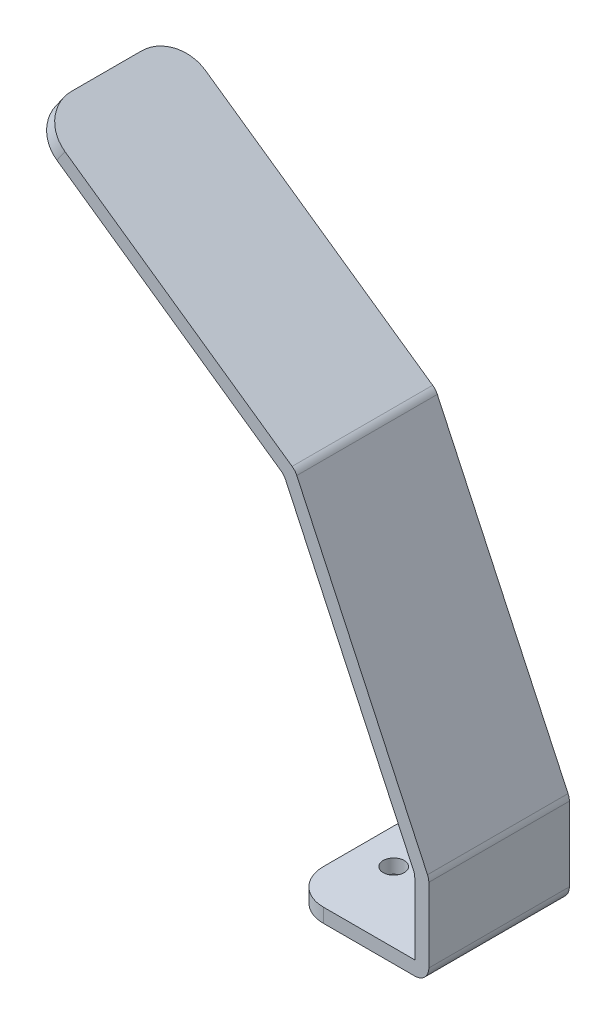
ISO-10303-21;
HEADER;
FILE_DESCRIPTION(('STEP AP214'),'2;1');
FILE_NAME('part.step','',(''),(''),'','','');
FILE_SCHEMA(('AUTOMOTIVE_DESIGN { 1 0 10303 214 1 1 1 1 }'));
ENDSEC;
DATA;
#1=APPLICATION_CONTEXT('core data for automotive mechanical design processes');
#2=APPLICATION_PROTOCOL_DEFINITION('international standard','automotive_design',2000,#1);
#3=PRODUCT_CONTEXT('',#1,'mechanical');
#4=PRODUCT('Part','Part','',(#3));
#5=PRODUCT_RELATED_PRODUCT_CATEGORY('part','',(#4));
#6=PRODUCT_DEFINITION_FORMATION('','',#4);
#7=PRODUCT_DEFINITION_CONTEXT('part definition',#1,'design');
#8=PRODUCT_DEFINITION('design','',#6,#7);
#9=PRODUCT_DEFINITION_SHAPE('','',#8);
#10=(LENGTH_UNIT() NAMED_UNIT(*) SI_UNIT(.MILLI.,.METRE.));
#11=(NAMED_UNIT(*) PLANE_ANGLE_UNIT() SI_UNIT($,.RADIAN.));
#12=(NAMED_UNIT(*) SI_UNIT($,.STERADIAN.) SOLID_ANGLE_UNIT());
#13=UNCERTAINTY_MEASURE_WITH_UNIT(LENGTH_MEASURE(1.E-05),#10,'distance_accuracy_value','');
#14=(GEOMETRIC_REPRESENTATION_CONTEXT(3) GLOBAL_UNCERTAINTY_ASSIGNED_CONTEXT((#13)) GLOBAL_UNIT_ASSIGNED_CONTEXT((#10,
#11,#12)) REPRESENTATION_CONTEXT('',''));
#15=CARTESIAN_POINT('',(0.,0.,0.));
#16=DIRECTION('',(0.,0.,1.));
#17=DIRECTION('',(1.,0.,0.));
#18=AXIS2_PLACEMENT_3D('',#15,#16,#17);
#19=CARTESIAN_POINT('',(0.,0.,10.));
#20=DIRECTION('',(1.,0.,0.));
#21=DIRECTION('',(0.,0.,-1.));
#22=AXIS2_PLACEMENT_3D('',#19,#20,#21);
#23=PLANE('',#22);
#24=DIRECTION('',(0.,0.,-1.));
#25=VECTOR('',#24,1.);
#26=CARTESIAN_POINT('',(0.,0.,10.));
#27=LINE('',#26,#25);
#28=CARTESIAN_POINT('',(0.,0.,5.));
#29=VERTEX_POINT('',#28);
#30=CARTESIAN_POINT('',(0.,0.,-5.));
#31=VERTEX_POINT('',#30);
#32=EDGE_CURVE('E245',#29,#31,#27,.T.);
#33=ORIENTED_EDGE('',*,*,#32,.F.);
#34=DIRECTION('',(0.,-1.,0.));
#35=VECTOR('',#34,1.);
#36=CARTESIAN_POINT('',(0.,0.,5.));
#37=LINE('',#36,#35);
#38=CARTESIAN_POINT('',(0.,2.,5.));
#39=VERTEX_POINT('',#38);
#40=EDGE_CURVE('E333',#29,#39,#37,.F.);
#41=ORIENTED_EDGE('',*,*,#40,.T.);
#42=DIRECTION('',(0.,0.,-1.));
#43=VECTOR('',#42,1.);
#44=CARTESIAN_POINT('',(0.,2.,10.));
#45=LINE('',#44,#43);
#46=CARTESIAN_POINT('',(0.,2.,-5.));
#47=VERTEX_POINT('',#46);
#48=EDGE_CURVE('E199',#39,#47,#45,.T.);
#49=ORIENTED_EDGE('',*,*,#48,.T.);
#50=DIRECTION('',(0.,-1.,0.));
#51=VECTOR('',#50,1.);
#52=CARTESIAN_POINT('',(0.,0.,-5.));
#53=LINE('',#52,#51);
#54=EDGE_CURVE('E329',#47,#31,#53,.T.);
#55=ORIENTED_EDGE('',*,*,#54,.T.);
#56=EDGE_LOOP('',(#33,#41,#49,#55));
#57=FACE_BOUND('',#56,.T.);
#58=ADVANCED_FACE('F39',(#57),#23,.F.);
#59=CARTESIAN_POINT('',(0.,0.,10.));
#60=DIRECTION('',(0.,1.,0.));
#61=DIRECTION('',(0.,0.,1.));
#62=AXIS2_PLACEMENT_3D('',#59,#60,#61);
#63=PLANE('',#62);
#64=CARTESIAN_POINT('',(5.,0.,0.));
#65=DIRECTION('',(0.,-1.,0.));
#66=DIRECTION('',(0.,0.,-1.));
#67=AXIS2_PLACEMENT_3D('',#64,#65,#66);
#68=CIRCLE('',#67,1.5);
#69=CARTESIAN_POINT('',(5.,0.,-1.5));
#70=VERTEX_POINT('',#69);
#71=EDGE_CURVE('E363',#70,#70,#68,.T.);
#72=ORIENTED_EDGE('',*,*,#71,.F.);
#73=EDGE_LOOP('',(#72));
#74=FACE_BOUND('',#73,.T.);
#75=CARTESIAN_POINT('',(15.,0.,0.));
#76=DIRECTION('',(0.,-1.,0.));
#77=DIRECTION('',(0.,0.,-1.));
#78=AXIS2_PLACEMENT_3D('',#75,#76,#77);
#79=CIRCLE('',#78,1.5);
#80=CARTESIAN_POINT('',(15.,0.,-1.5));
#81=VERTEX_POINT('',#80);
#82=EDGE_CURVE('E370',#81,#81,#79,.T.);
#83=ORIENTED_EDGE('',*,*,#82,.F.);
#84=EDGE_LOOP('',(#83));
#85=FACE_BOUND('',#84,.T.);
#86=DIRECTION('',(1.,0.,0.));
#87=VECTOR('',#86,1.);
#88=CARTESIAN_POINT('',(0.,0.,10.));
#89=LINE('',#88,#87);
#90=CARTESIAN_POINT('',(5.,0.,10.));
#91=VERTEX_POINT('',#90);
#92=CARTESIAN_POINT('',(18.,0.,10.));
#93=VERTEX_POINT('',#92);
#94=EDGE_CURVE('E237',#91,#93,#89,.T.);
#95=ORIENTED_EDGE('',*,*,#94,.F.);
#96=CARTESIAN_POINT('',(5.,0.,5.));
#97=DIRECTION('',(0.,1.,0.));
#98=DIRECTION('',(0.,0.,1.));
#99=AXIS2_PLACEMENT_3D('',#96,#97,#98);
#100=CIRCLE('',#99,5.);
#101=EDGE_CURVE('E326',#91,#29,#100,.F.);
#102=ORIENTED_EDGE('',*,*,#101,.T.);
#103=ORIENTED_EDGE('',*,*,#32,.T.);
#104=CARTESIAN_POINT('',(5.,0.,-5.));
#105=DIRECTION('',(0.,1.,0.));
#106=DIRECTION('',(0.,0.,1.));
#107=AXIS2_PLACEMENT_3D('',#104,#105,#106);
#108=CIRCLE('',#107,5.);
#109=CARTESIAN_POINT('',(5.,0.,-10.));
#110=VERTEX_POINT('',#109);
#111=EDGE_CURVE('E323',#31,#110,#108,.F.);
#112=ORIENTED_EDGE('',*,*,#111,.T.);
#113=DIRECTION('',(1.,0.,0.));
#114=VECTOR('',#113,1.);
#115=CARTESIAN_POINT('',(0.,0.,-10.));
#116=LINE('',#115,#114);
#117=CARTESIAN_POINT('',(18.,0.,-10.));
#118=VERTEX_POINT('',#117);
#119=EDGE_CURVE('E212',#110,#118,#116,.T.);
#120=ORIENTED_EDGE('',*,*,#119,.T.);
#121=DIRECTION('',(0.,0.,-1.));
#122=VECTOR('',#121,1.);
#123=CARTESIAN_POINT('',(18.,0.,10.));
#124=LINE('',#123,#122);
#125=EDGE_CURVE('E300',#118,#93,#124,.F.);
#126=ORIENTED_EDGE('',*,*,#125,.T.);
#127=EDGE_LOOP('',(#95,#102,#103,#112,#120,#126));
#128=FACE_BOUND('',#127,.T.);
#129=ADVANCED_FACE('F416',(#74,#85,#128),#63,.F.);
#130=CARTESIAN_POINT('',(20.,0.,10.));
#131=DIRECTION('',(-1.,0.,0.));
#132=DIRECTION('',(0.,0.,1.));
#133=AXIS2_PLACEMENT_3D('',#130,#131,#132);
#134=PLANE('',#133);
#135=DIRECTION('',(0.,1.,0.));
#136=VECTOR('',#135,1.);
#137=CARTESIAN_POINT('',(20.,0.,10.));
#138=LINE('',#137,#136);
#139=CARTESIAN_POINT('',(20.,2.,10.));
#140=VERTEX_POINT('',#139);
#141=CARTESIAN_POINT('',(20.,12.5566106747141,10.));
#142=VERTEX_POINT('',#141);
#143=EDGE_CURVE('E380',#140,#142,#138,.T.);
#144=ORIENTED_EDGE('',*,*,#143,.F.);
#145=DIRECTION('',(0.,0.,-1.));
#146=VECTOR('',#145,1.);
#147=CARTESIAN_POINT('',(20.,2.,10.));
#148=LINE('',#147,#146);
#149=CARTESIAN_POINT('',(20.,2.,-10.));
#150=VERTEX_POINT('',#149);
#151=EDGE_CURVE('E296',#140,#150,#148,.T.);
#152=ORIENTED_EDGE('',*,*,#151,.T.);
#153=DIRECTION('',(0.,1.,0.));
#154=VECTOR('',#153,1.);
#155=CARTESIAN_POINT('',(20.,0.,-10.));
#156=LINE('',#155,#154);
#157=CARTESIAN_POINT('',(20.,12.5566106747141,-10.));
#158=VERTEX_POINT('',#157);
#159=EDGE_CURVE('E215',#150,#158,#156,.T.);
#160=ORIENTED_EDGE('',*,*,#159,.T.);
#161=DIRECTION('',(0.,0.,-1.));
#162=VECTOR('',#161,1.);
#163=CARTESIAN_POINT('',(20.,12.5566106747141,10.));
#164=LINE('',#163,#162);
#165=EDGE_CURVE('E293',#158,#142,#164,.F.);
#166=ORIENTED_EDGE('',*,*,#165,.T.);
#167=EDGE_LOOP('',(#144,#152,#160,#166));
#168=FACE_BOUND('',#167,.T.);
#169=ADVANCED_FACE('F427',(#168),#134,.F.);
#170=CARTESIAN_POINT('',(20.,13.,10.));
#171=DIRECTION('',(-0.906307787036649,-0.422618261740701,0.));
#172=DIRECTION('',(0.422618261740701,-0.906307787036649,0.));
#173=AXIS2_PLACEMENT_3D('',#170,#171,#172);
#174=PLANE('',#173);
#175=DIRECTION('',(-0.422618261740701,0.906307787036649,0.));
#176=VECTOR('',#175,1.);
#177=CARTESIAN_POINT('',(20.,13.,-10.));
#178=LINE('',#177,#176);
#179=CARTESIAN_POINT('',(19.8126155740733,13.4018471981955,-10.));
#180=VERTEX_POINT('',#179);
#181=CARTESIAN_POINT('',(1.2086586655486,53.2981615373882,-10.));
#182=VERTEX_POINT('',#181);
#183=EDGE_CURVE('E219',#180,#182,#178,.T.);
#184=ORIENTED_EDGE('',*,*,#183,.T.);
#185=DIRECTION('',(0.,0.,-1.));
#186=VECTOR('',#185,1.);
#187=CARTESIAN_POINT('',(1.2086586655486,53.2981615373882,10.));
#188=LINE('',#187,#186);
#189=CARTESIAN_POINT('',(1.2086586655486,53.2981615373882,10.));
#190=VERTEX_POINT('',#189);
#191=EDGE_CURVE('E278',#182,#190,#188,.F.);
#192=ORIENTED_EDGE('',*,*,#191,.T.);
#193=DIRECTION('',(-0.422618261740701,0.906307787036649,0.));
#194=VECTOR('',#193,1.);
#195=CARTESIAN_POINT('',(20.,13.,10.));
#196=LINE('',#195,#194);
#197=CARTESIAN_POINT('',(19.8126155740733,13.4018471981955,10.));
#198=VERTEX_POINT('',#197);
#199=EDGE_CURVE('E384',#198,#190,#196,.T.);
#200=ORIENTED_EDGE('',*,*,#199,.F.);
#201=DIRECTION('',(0.,0.,-1.));
#202=VECTOR('',#201,1.);
#203=CARTESIAN_POINT('',(19.8126155740733,13.4018471981955,10.));
#204=LINE('',#203,#202);
#205=EDGE_CURVE('E274',#198,#180,#204,.T.);
#206=ORIENTED_EDGE('',*,*,#205,.T.);
#207=EDGE_LOOP('',(#184,#192,#200,#206));
#208=FACE_BOUND('',#207,.T.);
#209=ADVANCED_FACE('F436',(#208),#174,.F.);
#210=CARTESIAN_POINT('',(0.982178221668467,53.7838504166492,10.));
#211=DIRECTION('',(-0.573576436351042,-0.819152044288995,0.));
#212=DIRECTION('',(0.819152044288995,-0.573576436351042,0.));
#213=AXIS2_PLACEMENT_3D('',#210,#211,#212);
#214=PLANE('',#213);
#215=DIRECTION('',(-0.819152044288995,0.573576436351042,0.));
#216=VECTOR('',#215,1.);
#217=CARTESIAN_POINT('',(0.982178221668467,53.7838504166492,-10.));
#218=LINE('',#217,#216);
#219=CARTESIAN_POINT('',(0.543195964177389,54.0912291024848,-10.));
#220=VERTEX_POINT('',#219);
#221=CARTESIAN_POINT('',(-31.7839035498913,76.7269078706909,-10.));
#222=VERTEX_POINT('',#221);
#223=EDGE_CURVE('E223',#220,#222,#218,.T.);
#224=ORIENTED_EDGE('',*,*,#223,.T.);
#225=CARTESIAN_POINT('',(-31.7839035498913,76.7269078706909,-5.));
#226=DIRECTION('',(-0.573576436351042,-0.819152044288995,0.));
#227=DIRECTION('',(0.819152044288995,-0.573576436351042,0.));
#228=AXIS2_PLACEMENT_3D('',#225,#226,#227);
#229=CIRCLE('',#228,5.);
#230=CARTESIAN_POINT('',(-35.8796637713363,79.5947900524461,-5.));
#231=VERTEX_POINT('',#230);
#232=EDGE_CURVE('E11',#222,#231,#229,.F.);
#233=ORIENTED_EDGE('',*,*,#232,.T.);
#234=DIRECTION('',(0.,0.,-1.));
#235=VECTOR('',#234,1.);
#236=CARTESIAN_POINT('',(-35.8796637713363,79.5947900524461,10.));
#237=LINE('',#236,#235);
#238=CARTESIAN_POINT('',(-35.8796637713363,79.5947900524461,5.));
#239=VERTEX_POINT('',#238);
#240=EDGE_CURVE('E242',#239,#231,#237,.T.);
#241=ORIENTED_EDGE('',*,*,#240,.F.);
#242=CARTESIAN_POINT('',(-31.7839035498913,76.7269078706909,5.));
#243=DIRECTION('',(-0.573576436351042,-0.819152044288995,0.));
#244=DIRECTION('',(0.819152044288995,-0.573576436351042,0.));
#245=AXIS2_PLACEMENT_3D('',#242,#243,#244);
#246=CIRCLE('',#245,5.);
#247=CARTESIAN_POINT('',(-31.7839035498913,76.7269078706909,10.));
#248=VERTEX_POINT('',#247);
#249=EDGE_CURVE('E49',#239,#248,#246,.F.);
#250=ORIENTED_EDGE('',*,*,#249,.T.);
#251=DIRECTION('',(-0.819152044288995,0.573576436351042,0.));
#252=VECTOR('',#251,1.);
#253=CARTESIAN_POINT('',(0.982178221668467,53.7838504166492,10.));
#254=LINE('',#253,#252);
#255=CARTESIAN_POINT('',(0.543195964177389,54.0912291024848,10.));
#256=VERTEX_POINT('',#255);
#257=EDGE_CURVE('E388',#256,#248,#254,.T.);
#258=ORIENTED_EDGE('',*,*,#257,.F.);
#259=DIRECTION('',(0.,0.,-1.));
#260=VECTOR('',#259,1.);
#261=CARTESIAN_POINT('',(0.54319596417739,54.0912291024848,10.));
#262=LINE('',#261,#260);
#263=EDGE_CURVE('E260',#256,#220,#262,.T.);
#264=ORIENTED_EDGE('',*,*,#263,.T.);
#265=EDGE_LOOP('',(#224,#233,#241,#250,#258,#264));
#266=FACE_BOUND('',#265,.T.);
#267=ADVANCED_FACE('F444',(#266),#214,.F.);
#268=CARTESIAN_POINT('',(-35.8796637713363,79.5947900524461,10.));
#269=DIRECTION('',(0.819152044288991,-0.573576436351047,0.));
#270=DIRECTION('',(0.573576436351047,0.819152044288991,0.));
#271=AXIS2_PLACEMENT_3D('',#268,#269,#270);
#272=PLANE('',#271);
#273=ORIENTED_EDGE('',*,*,#240,.T.);
#274=DIRECTION('',(-0.573576436351047,-0.819152044288991,0.));
#275=VECTOR('',#274,1.);
#276=CARTESIAN_POINT('',(-37.0268166440384,77.9564859638681,-5.));
#277=LINE('',#276,#275);
#278=CARTESIAN_POINT('',(-37.0268166440384,77.9564859638681,-5.));
#279=VERTEX_POINT('',#278);
#280=EDGE_CURVE('E349',#231,#279,#277,.T.);
#281=ORIENTED_EDGE('',*,*,#280,.T.);
#282=DIRECTION('',(0.,0.,-1.));
#283=VECTOR('',#282,1.);
#284=CARTESIAN_POINT('',(-37.0268166440384,77.9564859638681,10.));
#285=LINE('',#284,#283);
#286=CARTESIAN_POINT('',(-37.0268166440384,77.9564859638681,5.));
#287=VERTEX_POINT('',#286);
#288=EDGE_CURVE('E198',#287,#279,#285,.T.);
#289=ORIENTED_EDGE('',*,*,#288,.F.);
#290=DIRECTION('',(-0.573576436351047,-0.819152044288991,0.));
#291=VECTOR('',#290,1.);
#292=CARTESIAN_POINT('',(-35.8796637713363,79.5947900524461,5.));
#293=LINE('',#292,#291);
#294=EDGE_CURVE('E62',#287,#239,#293,.F.);
#295=ORIENTED_EDGE('',*,*,#294,.T.);
#296=EDGE_LOOP('',(#273,#281,#289,#295));
#297=FACE_BOUND('',#296,.T.);
#298=ADVANCED_FACE('F450',(#297),#272,.F.);
#299=CARTESIAN_POINT('',(-0.603956908524699,52.4529250139068,10.));
#300=DIRECTION('',(0.573576436351042,0.819152044288995,0.));
#301=DIRECTION('',(-0.819152044288995,0.573576436351042,0.));
#302=AXIS2_PLACEMENT_3D('',#299,#300,#301);
#303=PLANE('',#302);
#304=ORIENTED_EDGE('',*,*,#288,.T.);
#305=CARTESIAN_POINT('',(-32.9310564225934,75.0886037821129,-5.));
#306=DIRECTION('',(0.573576436351042,0.819152044288995,0.));
#307=DIRECTION('',(-0.819152044288995,0.573576436351042,0.));
#308=AXIS2_PLACEMENT_3D('',#305,#306,#307);
#309=CIRCLE('',#308,5.);
#310=CARTESIAN_POINT('',(-32.9310564225934,75.0886037821129,-10.));
#311=VERTEX_POINT('',#310);
#312=EDGE_CURVE('E356',#279,#311,#309,.F.);
#313=ORIENTED_EDGE('',*,*,#312,.T.);
#314=DIRECTION('',(0.819152044288995,-0.573576436351042,0.));
#315=VECTOR('',#314,1.);
#316=CARTESIAN_POINT('',(-0.603956908524699,52.4529250139068,-10.));
#317=LINE('',#316,#315);
#318=CARTESIAN_POINT('',(-1.04293916601578,52.7603036997424,-10.));
#319=VERTEX_POINT('',#318);
#320=EDGE_CURVE('E226',#311,#319,#317,.T.);
#321=ORIENTED_EDGE('',*,*,#320,.T.);
#322=DIRECTION('',(0.,0.,-1.));
#323=VECTOR('',#322,1.);
#324=CARTESIAN_POINT('',(-1.04293916601578,52.7603036997424,10.));
#325=LINE('',#324,#323);
#326=CARTESIAN_POINT('',(-1.04293916601578,52.7603036997424,10.));
#327=VERTEX_POINT('',#326);
#328=EDGE_CURVE('E256',#319,#327,#325,.F.);
#329=ORIENTED_EDGE('',*,*,#328,.T.);
#330=DIRECTION('',(0.819152044288995,-0.573576436351042,0.));
#331=VECTOR('',#330,1.);
#332=CARTESIAN_POINT('',(-0.603956908524699,52.4529250139068,10.));
#333=LINE('',#332,#331);
#334=CARTESIAN_POINT('',(-32.9310564225934,75.0886037821129,10.));
#335=VERTEX_POINT('',#334);
#336=EDGE_CURVE('E392',#335,#327,#333,.T.);
#337=ORIENTED_EDGE('',*,*,#336,.F.);
#338=CARTESIAN_POINT('',(-32.9310564225934,75.0886037821129,5.));
#339=DIRECTION('',(0.573576436351042,0.819152044288995,0.));
#340=DIRECTION('',(-0.819152044288995,0.573576436351042,0.));
#341=AXIS2_PLACEMENT_3D('',#338,#339,#340);
#342=CIRCLE('',#341,5.);
#343=EDGE_CURVE('E353',#335,#287,#342,.F.);
#344=ORIENTED_EDGE('',*,*,#343,.T.);
#345=EDGE_LOOP('',(#304,#313,#321,#329,#337,#344));
#346=FACE_BOUND('',#345,.T.);
#347=ADVANCED_FACE('F452',(#346),#303,.F.);
#348=CARTESIAN_POINT('',(18.,12.5566106747141,10.));
#349=DIRECTION('',(0.906307787036649,0.422618261740701,0.));
#350=DIRECTION('',(-0.422618261740701,0.906307787036649,0.));
#351=AXIS2_PLACEMENT_3D('',#348,#349,#350);
#352=PLANE('',#351);
#353=DIRECTION('',(0.422618261740701,-0.906307787036649,0.));
#354=VECTOR('',#353,1.);
#355=CARTESIAN_POINT('',(18.,12.5566106747141,10.));
#356=LINE('',#355,#354);
#357=CARTESIAN_POINT('',(-0.377476464644561,51.9672361346458,10.));
#358=VERTEX_POINT('',#357);
#359=CARTESIAN_POINT('',(17.8126155740733,12.9584578729096,10.));
#360=VERTEX_POINT('',#359);
#361=EDGE_CURVE('E187',#358,#360,#356,.T.);
#362=ORIENTED_EDGE('',*,*,#361,.F.);
#363=DIRECTION('',(0.,0.,-1.));
#364=VECTOR('',#363,1.);
#365=CARTESIAN_POINT('',(-0.377476464644566,51.9672361346458,-10.));
#366=LINE('',#365,#364);
#367=CARTESIAN_POINT('',(-0.377476464644561,51.9672361346458,-10.));
#368=VERTEX_POINT('',#367);
#369=EDGE_CURVE('E252',#358,#368,#366,.T.);
#370=ORIENTED_EDGE('',*,*,#369,.T.);
#371=DIRECTION('',(0.422618261740701,-0.906307787036649,0.));
#372=VECTOR('',#371,1.);
#373=CARTESIAN_POINT('',(18.,12.5566106747141,-10.));
#374=LINE('',#373,#372);
#375=CARTESIAN_POINT('',(17.8126155740733,12.9584578729096,-10.));
#376=VERTEX_POINT('',#375);
#377=EDGE_CURVE('E229',#368,#376,#374,.T.);
#378=ORIENTED_EDGE('',*,*,#377,.T.);
#379=DIRECTION('',(0.,0.,-1.));
#380=VECTOR('',#379,1.);
#381=CARTESIAN_POINT('',(17.8126155740733,12.9584578729096,10.));
#382=LINE('',#381,#380);
#383=EDGE_CURVE('E249',#376,#360,#382,.F.);
#384=ORIENTED_EDGE('',*,*,#383,.T.);
#385=EDGE_LOOP('',(#362,#370,#378,#384));
#386=FACE_BOUND('',#385,.T.);
#387=ADVANCED_FACE('F460',(#386),#352,.F.);
#388=CARTESIAN_POINT('',(18.,2.,10.));
#389=DIRECTION('',(1.,0.,0.));
#390=DIRECTION('',(0.,0.,-1.));
#391=AXIS2_PLACEMENT_3D('',#388,#389,#390);
#392=PLANE('',#391);
#393=DIRECTION('',(0.,-1.,0.));
#394=VECTOR('',#393,1.);
#395=CARTESIAN_POINT('',(18.,2.,10.));
#396=LINE('',#395,#394);
#397=CARTESIAN_POINT('',(18.,12.1132213494282,10.));
#398=VERTEX_POINT('',#397);
#399=CARTESIAN_POINT('',(18.,2.,10.));
#400=VERTEX_POINT('',#399);
#401=EDGE_CURVE('E173',#398,#400,#396,.T.);
#402=ORIENTED_EDGE('',*,*,#401,.F.);
#403=DIRECTION('',(0.,0.,-1.));
#404=VECTOR('',#403,1.);
#405=CARTESIAN_POINT('',(18.,12.1132213494282,-9.99999999999999));
#406=LINE('',#405,#404);
#407=CARTESIAN_POINT('',(18.,12.1132213494282,-10.));
#408=VERTEX_POINT('',#407);
#409=EDGE_CURVE('E290',#398,#408,#406,.T.);
#410=ORIENTED_EDGE('',*,*,#409,.T.);
#411=DIRECTION('',(0.,-1.,0.));
#412=VECTOR('',#411,1.);
#413=CARTESIAN_POINT('',(18.,2.,-10.));
#414=LINE('',#413,#412);
#415=CARTESIAN_POINT('',(18.,2.,-10.));
#416=VERTEX_POINT('',#415);
#417=EDGE_CURVE('E193',#408,#416,#414,.T.);
#418=ORIENTED_EDGE('',*,*,#417,.T.);
#419=DIRECTION('',(0.,0.,-1.));
#420=VECTOR('',#419,1.);
#421=CARTESIAN_POINT('',(18.,2.,10.));
#422=LINE('',#421,#420);
#423=EDGE_CURVE('E190',#400,#416,#422,.T.);
#424=ORIENTED_EDGE('',*,*,#423,.F.);
#425=EDGE_LOOP('',(#402,#410,#418,#424));
#426=FACE_BOUND('',#425,.T.);
#427=ADVANCED_FACE('F191',(#426),#392,.F.);
#428=CARTESIAN_POINT('',(0.,2.,10.));
#429=DIRECTION('',(0.,-1.,0.));
#430=DIRECTION('',(0.,0.,-1.));
#431=AXIS2_PLACEMENT_3D('',#428,#429,#430);
#432=PLANE('',#431);
#433=CARTESIAN_POINT('',(5.,2.,0.));
#434=DIRECTION('',(0.,-1.,0.));
#435=DIRECTION('',(0.,0.,-1.));
#436=AXIS2_PLACEMENT_3D('',#433,#434,#435);
#437=CIRCLE('',#436,1.5);
#438=CARTESIAN_POINT('',(5.,2.,-1.5));
#439=VERTEX_POINT('',#438);
#440=EDGE_CURVE('E43',#439,#439,#437,.T.);
#441=ORIENTED_EDGE('',*,*,#440,.T.);
#442=EDGE_LOOP('',(#441));
#443=FACE_BOUND('',#442,.T.);
#444=CARTESIAN_POINT('',(15.,2.,0.));
#445=DIRECTION('',(0.,-1.,0.));
#446=DIRECTION('',(0.,0.,-1.));
#447=AXIS2_PLACEMENT_3D('',#444,#445,#446);
#448=CIRCLE('',#447,1.5);
#449=CARTESIAN_POINT('',(15.,2.,-1.5));
#450=VERTEX_POINT('',#449);
#451=EDGE_CURVE('E360',#450,#450,#448,.T.);
#452=ORIENTED_EDGE('',*,*,#451,.T.);
#453=EDGE_LOOP('',(#452));
#454=FACE_BOUND('',#453,.T.);
#455=ORIENTED_EDGE('',*,*,#48,.F.);
#456=CARTESIAN_POINT('',(5.,2.,5.));
#457=DIRECTION('',(0.,-1.,0.));
#458=DIRECTION('',(0.,0.,-1.));
#459=AXIS2_PLACEMENT_3D('',#456,#457,#458);
#460=CIRCLE('',#459,5.);
#461=CARTESIAN_POINT('',(5.,2.,10.));
#462=VERTEX_POINT('',#461);
#463=EDGE_CURVE('E204',#39,#462,#460,.F.);
#464=ORIENTED_EDGE('',*,*,#463,.T.);
#465=DIRECTION('',(-1.,0.,0.));
#466=VECTOR('',#465,1.);
#467=CARTESIAN_POINT('',(0.,2.,10.));
#468=LINE('',#467,#466);
#469=EDGE_CURVE('E178',#400,#462,#468,.T.);
#470=ORIENTED_EDGE('',*,*,#469,.F.);
#471=ORIENTED_EDGE('',*,*,#423,.T.);
#472=DIRECTION('',(-1.,0.,0.));
#473=VECTOR('',#472,1.);
#474=CARTESIAN_POINT('',(0.,2.,-10.));
#475=LINE('',#474,#473);
#476=CARTESIAN_POINT('',(5.,2.,-10.));
#477=VERTEX_POINT('',#476);
#478=EDGE_CURVE('E235',#416,#477,#475,.T.);
#479=ORIENTED_EDGE('',*,*,#478,.T.);
#480=CARTESIAN_POINT('',(5.,2.,-5.));
#481=DIRECTION('',(0.,-1.,0.));
#482=DIRECTION('',(0.,0.,-1.));
#483=AXIS2_PLACEMENT_3D('',#480,#481,#482);
#484=CIRCLE('',#483,5.);
#485=EDGE_CURVE('E336',#477,#47,#484,.F.);
#486=ORIENTED_EDGE('',*,*,#485,.T.);
#487=EDGE_LOOP('',(#455,#464,#470,#471,#479,#486));
#488=FACE_BOUND('',#487,.T.);
#489=ADVANCED_FACE('F202',(#443,#454,#488),#432,.F.);
#490=CARTESIAN_POINT('',(0.,0.,10.));
#491=DIRECTION('',(0.,0.,-1.));
#492=DIRECTION('',(-1.,0.,0.));
#493=AXIS2_PLACEMENT_3D('',#490,#491,#492);
#494=PLANE('',#493);
#495=ORIENTED_EDGE('',*,*,#469,.T.);
#496=DIRECTION('',(0.,-1.,0.));
#497=VECTOR('',#496,1.);
#498=CARTESIAN_POINT('',(5.,0.,10.));
#499=LINE('',#498,#497);
#500=EDGE_CURVE('E320',#462,#91,#499,.T.);
#501=ORIENTED_EDGE('',*,*,#500,.T.);
#502=ORIENTED_EDGE('',*,*,#94,.T.);
#503=CARTESIAN_POINT('',(18.,2.,10.));
#504=DIRECTION('',(0.,0.,-1.));
#505=DIRECTION('',(-1.,0.,0.));
#506=AXIS2_PLACEMENT_3D('',#503,#504,#505);
#507=CIRCLE('',#506,2.);
#508=EDGE_CURVE('E284',#93,#140,#507,.F.);
#509=ORIENTED_EDGE('',*,*,#508,.T.);
#510=ORIENTED_EDGE('',*,*,#143,.T.);
#511=CARTESIAN_POINT('',(18.,12.5566106747141,10.));
#512=DIRECTION('',(0.,0.,-1.));
#513=DIRECTION('',(-1.,0.,0.));
#514=AXIS2_PLACEMENT_3D('',#511,#512,#513);
#515=CIRCLE('',#514,2.);
#516=EDGE_CURVE('E281',#142,#198,#515,.F.);
#517=ORIENTED_EDGE('',*,*,#516,.T.);
#518=ORIENTED_EDGE('',*,*,#199,.T.);
#519=CARTESIAN_POINT('',(-0.603956908524693,52.4529250139068,10.));
#520=DIRECTION('',(0.,0.,-1.));
#521=DIRECTION('',(-1.,0.,0.));
#522=AXIS2_PLACEMENT_3D('',#519,#520,#521);
#523=CIRCLE('',#522,2.);
#524=EDGE_CURVE('E287',#190,#256,#523,.F.);
#525=ORIENTED_EDGE('',*,*,#524,.T.);
#526=ORIENTED_EDGE('',*,*,#257,.T.);
#527=DIRECTION('',(-0.573576436351047,-0.819152044288991,0.));
#528=VECTOR('',#527,1.);
#529=CARTESIAN_POINT('',(-57.3771739696414,40.175929734713,10.));
#530=LINE('',#529,#528);
#531=EDGE_CURVE('E316',#248,#335,#530,.T.);
#532=ORIENTED_EDGE('',*,*,#531,.T.);
#533=ORIENTED_EDGE('',*,*,#336,.T.);
#534=CARTESIAN_POINT('',(-2.19009203871786,51.1219996111644,10.));
#535=DIRECTION('',(0.,0.,-1.));
#536=DIRECTION('',(-1.,0.,0.));
#537=AXIS2_PLACEMENT_3D('',#534,#535,#536);
#538=CIRCLE('',#537,2.);
#539=EDGE_CURVE('E308',#327,#358,#538,.T.);
#540=ORIENTED_EDGE('',*,*,#539,.T.);
#541=ORIENTED_EDGE('',*,*,#361,.T.);
#542=CARTESIAN_POINT('',(16.,12.1132213494282,10.));
#543=DIRECTION('',(0.,0.,-1.));
#544=DIRECTION('',(-1.,0.,0.));
#545=AXIS2_PLACEMENT_3D('',#542,#543,#544);
#546=CIRCLE('',#545,2.);
#547=EDGE_CURVE('E182',#360,#398,#546,.T.);
#548=ORIENTED_EDGE('',*,*,#547,.T.);
#549=ORIENTED_EDGE('',*,*,#401,.T.);
#550=EDGE_LOOP('',(#495,#501,#502,#509,#510,#517,#518,#525,#526,#532,#533,#540,#541,#548,#549));
#551=FACE_BOUND('',#550,.T.);
#552=ADVANCED_FACE('F175',(#551),#494,.F.);
#553=CARTESIAN_POINT('',(0.,0.,-10.));
#554=DIRECTION('',(0.,0.,-1.));
#555=DIRECTION('',(-1.,0.,0.));
#556=AXIS2_PLACEMENT_3D('',#553,#554,#555);
#557=PLANE('',#556);
#558=ORIENTED_EDGE('',*,*,#119,.F.);
#559=DIRECTION('',(0.,-1.,0.));
#560=VECTOR('',#559,1.);
#561=CARTESIAN_POINT('',(5.,2.,-10.));
#562=LINE('',#561,#560);
#563=EDGE_CURVE('E344',#110,#477,#562,.F.);
#564=ORIENTED_EDGE('',*,*,#563,.T.);
#565=ORIENTED_EDGE('',*,*,#478,.F.);
#566=ORIENTED_EDGE('',*,*,#417,.F.);
#567=CARTESIAN_POINT('',(16.,12.1132213494282,-10.));
#568=DIRECTION('',(0.,0.,-1.));
#569=DIRECTION('',(-1.,0.,0.));
#570=AXIS2_PLACEMENT_3D('',#567,#568,#569);
#571=CIRCLE('',#570,2.);
#572=EDGE_CURVE('E311',#408,#376,#571,.F.);
#573=ORIENTED_EDGE('',*,*,#572,.T.);
#574=ORIENTED_EDGE('',*,*,#377,.F.);
#575=CARTESIAN_POINT('',(-2.19009203871786,51.1219996111644,-10.));
#576=DIRECTION('',(0.,0.,-1.));
#577=DIRECTION('',(-1.,0.,0.));
#578=AXIS2_PLACEMENT_3D('',#575,#576,#577);
#579=CIRCLE('',#578,2.);
#580=EDGE_CURVE('E304',#368,#319,#579,.F.);
#581=ORIENTED_EDGE('',*,*,#580,.T.);
#582=ORIENTED_EDGE('',*,*,#320,.F.);
#583=DIRECTION('',(-0.573576436351047,-0.819152044288991,0.));
#584=VECTOR('',#583,1.);
#585=CARTESIAN_POINT('',(-31.7839035498913,76.7269078706909,-10.));
#586=LINE('',#585,#584);
#587=EDGE_CURVE('E341',#311,#222,#586,.F.);
#588=ORIENTED_EDGE('',*,*,#587,.T.);
#589=ORIENTED_EDGE('',*,*,#223,.F.);
#590=CARTESIAN_POINT('',(-0.603956908524693,52.4529250139068,-10.));
#591=DIRECTION('',(0.,0.,-1.));
#592=DIRECTION('',(-1.,0.,0.));
#593=AXIS2_PLACEMENT_3D('',#590,#591,#592);
#594=CIRCLE('',#593,2.);
#595=EDGE_CURVE('E271',#220,#182,#594,.T.);
#596=ORIENTED_EDGE('',*,*,#595,.T.);
#597=ORIENTED_EDGE('',*,*,#183,.F.);
#598=CARTESIAN_POINT('',(18.,12.5566106747141,-10.));
#599=DIRECTION('',(0.,0.,-1.));
#600=DIRECTION('',(-1.,0.,0.));
#601=AXIS2_PLACEMENT_3D('',#598,#599,#600);
#602=CIRCLE('',#601,2.);
#603=EDGE_CURVE('E264',#180,#158,#602,.T.);
#604=ORIENTED_EDGE('',*,*,#603,.T.);
#605=ORIENTED_EDGE('',*,*,#159,.F.);
#606=CARTESIAN_POINT('',(18.,2.,-10.));
#607=DIRECTION('',(0.,0.,-1.));
#608=DIRECTION('',(-1.,0.,0.));
#609=AXIS2_PLACEMENT_3D('',#606,#607,#608);
#610=CIRCLE('',#609,2.);
#611=EDGE_CURVE('E267',#150,#118,#610,.T.);
#612=ORIENTED_EDGE('',*,*,#611,.T.);
#613=EDGE_LOOP('',(#558,#564,#565,#566,#573,#574,#581,#582,#588,#589,#596,#597,#604,#605,#612));
#614=FACE_BOUND('',#613,.T.);
#615=ADVANCED_FACE('F404',(#614),#557,.T.);
#616=CARTESIAN_POINT('',(-2.19009203871786,51.1219996111644,10.));
#617=DIRECTION('',(0.,0.,1.));
#618=DIRECTION('',(1.,0.,0.));
#619=AXIS2_PLACEMENT_3D('',#616,#617,#618);
#620=CYLINDRICAL_SURFACE('',#619,2.);
#621=ORIENTED_EDGE('',*,*,#539,.F.);
#622=ORIENTED_EDGE('',*,*,#328,.F.);
#623=ORIENTED_EDGE('',*,*,#580,.F.);
#624=ORIENTED_EDGE('',*,*,#369,.F.);
#625=EDGE_LOOP('',(#621,#622,#623,#624));
#626=FACE_BOUND('',#625,.T.);
#627=ADVANCED_FACE('F459',(#626),#620,.F.);
#628=CARTESIAN_POINT('',(-0.603956908524693,52.4529250139068,10.));
#629=DIRECTION('',(0.,0.,-1.));
#630=DIRECTION('',(-1.,0.,0.));
#631=AXIS2_PLACEMENT_3D('',#628,#629,#630);
#632=CYLINDRICAL_SURFACE('',#631,2.);
#633=ORIENTED_EDGE('',*,*,#524,.F.);
#634=ORIENTED_EDGE('',*,*,#191,.F.);
#635=ORIENTED_EDGE('',*,*,#595,.F.);
#636=ORIENTED_EDGE('',*,*,#263,.F.);
#637=EDGE_LOOP('',(#633,#634,#635,#636));
#638=FACE_BOUND('',#637,.T.);
#639=ADVANCED_FACE('F442',(#638),#632,.T.);
#640=CARTESIAN_POINT('',(16.,12.1132213494282,10.));
#641=DIRECTION('',(0.,0.,1.));
#642=DIRECTION('',(1.,0.,0.));
#643=AXIS2_PLACEMENT_3D('',#640,#641,#642);
#644=CYLINDRICAL_SURFACE('',#643,2.);
#645=ORIENTED_EDGE('',*,*,#547,.F.);
#646=ORIENTED_EDGE('',*,*,#383,.F.);
#647=ORIENTED_EDGE('',*,*,#572,.F.);
#648=ORIENTED_EDGE('',*,*,#409,.F.);
#649=EDGE_LOOP('',(#645,#646,#647,#648));
#650=FACE_BOUND('',#649,.T.);
#651=ADVANCED_FACE('F401',(#650),#644,.F.);
#652=CARTESIAN_POINT('',(18.,2.,10.));
#653=DIRECTION('',(0.,0.,-1.));
#654=DIRECTION('',(-1.,0.,0.));
#655=AXIS2_PLACEMENT_3D('',#652,#653,#654);
#656=CYLINDRICAL_SURFACE('',#655,2.);
#657=ORIENTED_EDGE('',*,*,#508,.F.);
#658=ORIENTED_EDGE('',*,*,#125,.F.);
#659=ORIENTED_EDGE('',*,*,#611,.F.);
#660=ORIENTED_EDGE('',*,*,#151,.F.);
#661=EDGE_LOOP('',(#657,#658,#659,#660));
#662=FACE_BOUND('',#661,.T.);
#663=ADVANCED_FACE('F424',(#662),#656,.T.);
#664=CARTESIAN_POINT('',(18.,12.5566106747141,10.));
#665=DIRECTION('',(0.,0.,-1.));
#666=DIRECTION('',(-1.,0.,0.));
#667=AXIS2_PLACEMENT_3D('',#664,#665,#666);
#668=CYLINDRICAL_SURFACE('',#667,2.);
#669=ORIENTED_EDGE('',*,*,#516,.F.);
#670=ORIENTED_EDGE('',*,*,#165,.F.);
#671=ORIENTED_EDGE('',*,*,#603,.F.);
#672=ORIENTED_EDGE('',*,*,#205,.F.);
#673=EDGE_LOOP('',(#669,#670,#671,#672));
#674=FACE_BOUND('',#673,.T.);
#675=ADVANCED_FACE('F433',(#674),#668,.T.);
#676=CARTESIAN_POINT('',(5.,0.,5.));
#677=DIRECTION('',(0.,-1.,0.));
#678=DIRECTION('',(0.,0.,-1.));
#679=AXIS2_PLACEMENT_3D('',#676,#677,#678);
#680=CYLINDRICAL_SURFACE('',#679,5.);
#681=ORIENTED_EDGE('',*,*,#463,.F.);
#682=ORIENTED_EDGE('',*,*,#40,.F.);
#683=ORIENTED_EDGE('',*,*,#101,.F.);
#684=ORIENTED_EDGE('',*,*,#500,.F.);
#685=EDGE_LOOP('',(#681,#682,#683,#684));
#686=FACE_BOUND('',#685,.T.);
#687=ADVANCED_FACE('F418',(#686),#680,.T.);
#688=CARTESIAN_POINT('',(5.,0.,-5.));
#689=DIRECTION('',(0.,1.,0.));
#690=DIRECTION('',(0.,0.,1.));
#691=AXIS2_PLACEMENT_3D('',#688,#689,#690);
#692=CYLINDRICAL_SURFACE('',#691,5.);
#693=ORIENTED_EDGE('',*,*,#485,.F.);
#694=ORIENTED_EDGE('',*,*,#563,.F.);
#695=ORIENTED_EDGE('',*,*,#111,.F.);
#696=ORIENTED_EDGE('',*,*,#54,.F.);
#697=EDGE_LOOP('',(#693,#694,#695,#696));
#698=FACE_BOUND('',#697,.T.);
#699=ADVANCED_FACE('F410',(#698),#692,.T.);
#700=CARTESIAN_POINT('',(-31.7839035498913,76.7269078706909,-5.));
#701=DIRECTION('',(0.573576436351047,0.819152044288991,0.));
#702=DIRECTION('',(-0.819152044288991,0.573576436351047,0.));
#703=AXIS2_PLACEMENT_3D('',#700,#701,#702);
#704=CYLINDRICAL_SURFACE('',#703,5.);
#705=ORIENTED_EDGE('',*,*,#232,.F.);
#706=ORIENTED_EDGE('',*,*,#587,.F.);
#707=ORIENTED_EDGE('',*,*,#312,.F.);
#708=ORIENTED_EDGE('',*,*,#280,.F.);
#709=EDGE_LOOP('',(#705,#706,#707,#708));
#710=FACE_BOUND('',#709,.T.);
#711=ADVANCED_FACE('F448',(#710),#704,.T.);
#712=CARTESIAN_POINT('',(-57.3771739696414,40.175929734713,5.));
#713=DIRECTION('',(-0.573576436351047,-0.819152044288991,0.));
#714=DIRECTION('',(0.819152044288991,-0.573576436351047,0.));
#715=AXIS2_PLACEMENT_3D('',#712,#713,#714);
#716=CYLINDRICAL_SURFACE('',#715,5.);
#717=ORIENTED_EDGE('',*,*,#249,.F.);
#718=ORIENTED_EDGE('',*,*,#294,.F.);
#719=ORIENTED_EDGE('',*,*,#343,.F.);
#720=ORIENTED_EDGE('',*,*,#531,.F.);
#721=EDGE_LOOP('',(#717,#718,#719,#720));
#722=FACE_BOUND('',#721,.T.);
#723=ADVANCED_FACE('F41',(#722),#716,.T.);
#724=CARTESIAN_POINT('',(15.,3.,0.));
#725=DIRECTION('',(0.,-1.,0.));
#726=DIRECTION('',(0.,0.,-1.));
#727=AXIS2_PLACEMENT_3D('',#724,#725,#726);
#728=CYLINDRICAL_SURFACE('',#727,1.5);
#729=ORIENTED_EDGE('',*,*,#82,.T.);
#730=EDGE_LOOP('',(#729));
#731=FACE_BOUND('',#730,.T.);
#732=ORIENTED_EDGE('',*,*,#451,.F.);
#733=EDGE_LOOP('',(#732));
#734=FACE_BOUND('',#733,.T.);
#735=ADVANCED_FACE('F495',(#731,#734),#728,.F.);
#736=CARTESIAN_POINT('',(5.,3.,0.));
#737=DIRECTION('',(0.,-1.,0.));
#738=DIRECTION('',(0.,0.,-1.));
#739=AXIS2_PLACEMENT_3D('',#736,#737,#738);
#740=CYLINDRICAL_SURFACE('',#739,1.5);
#741=ORIENTED_EDGE('',*,*,#71,.T.);
#742=EDGE_LOOP('',(#741));
#743=FACE_BOUND('',#742,.T.);
#744=ORIENTED_EDGE('',*,*,#440,.F.);
#745=EDGE_LOOP('',(#744));
#746=FACE_BOUND('',#745,.T.);
#747=ADVANCED_FACE('F499',(#743,#746),#740,.F.);
#748=CLOSED_SHELL('',(#58,#129,#169,#209,#267,#298,#347,#387,#427,#489,#552,#615,#627,#639,#651,
#663,#675,#687,#699,#711,#723,#735,#747));
#749=MANIFOLD_SOLID_BREP('B2',#748);
#750=ADVANCED_BREP_SHAPE_REPRESENTATION('',(#18,#749),#14);
#751=SHAPE_DEFINITION_REPRESENTATION(#9,#750);
ENDSEC;
END-ISO-10303-21;
